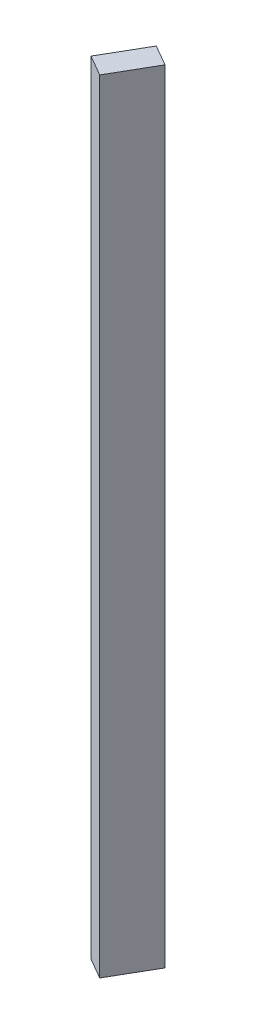
ISO-10303-21;
HEADER;
FILE_DESCRIPTION(('STEP AP214'),'2;1');
FILE_NAME('part.step','',(''),(''),'','','');
FILE_SCHEMA(('AUTOMOTIVE_DESIGN { 1 0 10303 214 1 1 1 1 }'));
ENDSEC;
DATA;
#1=APPLICATION_CONTEXT('core data for automotive mechanical design processes');
#2=APPLICATION_PROTOCOL_DEFINITION('international standard','automotive_design',2000,#1);
#3=PRODUCT_CONTEXT('',#1,'mechanical');
#4=PRODUCT('Part','Part','',(#3));
#5=PRODUCT_RELATED_PRODUCT_CATEGORY('part','',(#4));
#6=PRODUCT_DEFINITION_FORMATION('','',#4);
#7=PRODUCT_DEFINITION_CONTEXT('part definition',#1,'design');
#8=PRODUCT_DEFINITION('design','',#6,#7);
#9=PRODUCT_DEFINITION_SHAPE('','',#8);
#10=(LENGTH_UNIT() NAMED_UNIT(*) SI_UNIT(.MILLI.,.METRE.));
#11=(NAMED_UNIT(*) PLANE_ANGLE_UNIT() SI_UNIT($,.RADIAN.));
#12=(NAMED_UNIT(*) SI_UNIT($,.STERADIAN.) SOLID_ANGLE_UNIT());
#13=UNCERTAINTY_MEASURE_WITH_UNIT(LENGTH_MEASURE(1.E-05),#10,'distance_accuracy_value','');
#14=(GEOMETRIC_REPRESENTATION_CONTEXT(3) GLOBAL_UNCERTAINTY_ASSIGNED_CONTEXT((#13)) GLOBAL_UNIT_ASSIGNED_CONTEXT((#10,
#11,#12)) REPRESENTATION_CONTEXT('',''));
#15=CARTESIAN_POINT('',(0.,0.,0.));
#16=DIRECTION('',(0.,0.,1.));
#17=DIRECTION('',(1.,0.,0.));
#18=AXIS2_PLACEMENT_3D('',#15,#16,#17);
#19=CARTESIAN_POINT('',(84.8704895708749,-360.,11.));
#20=DIRECTION('',(0.5,0.,-0.866025403784439));
#21=DIRECTION('',(0.,-1.,0.));
#22=AXIS2_PLACEMENT_3D('',#19,#20,#21);
#23=PLANE('',#22);
#24=DIRECTION('',(0.866025403784439,0.,0.5));
#25=VECTOR('',#24,1.);
#26=CARTESIAN_POINT('',(65.8179306876172,-360.,0.));
#27=LINE('',#26,#25);
#28=CARTESIAN_POINT('',(65.8179306876172,-360.,0.));
#29=VERTEX_POINT('',#28);
#30=CARTESIAN_POINT('',(84.8704895708749,-360.,11.));
#31=VERTEX_POINT('',#30);
#32=EDGE_CURVE('E38',#29,#31,#27,.T.);
#33=ORIENTED_EDGE('',*,*,#32,.F.);
#34=DIRECTION('',(0.,1.,0.));
#35=VECTOR('',#34,1.);
#36=CARTESIAN_POINT('',(65.8179306876172,-360.,0.));
#37=LINE('',#36,#35);
#38=CARTESIAN_POINT('',(65.8179306876172,360.,0.));
#39=VERTEX_POINT('',#38);
#40=EDGE_CURVE('E11',#29,#39,#37,.T.);
#41=ORIENTED_EDGE('',*,*,#40,.T.);
#42=DIRECTION('',(-0.866025403784439,0.,-0.5));
#43=VECTOR('',#42,1.);
#44=CARTESIAN_POINT('',(65.8179306876172,360.,0.));
#45=LINE('',#44,#43);
#46=CARTESIAN_POINT('',(84.8704895708749,360.,11.));
#47=VERTEX_POINT('',#46);
#48=EDGE_CURVE('E99',#47,#39,#45,.T.);
#49=ORIENTED_EDGE('',*,*,#48,.F.);
#50=DIRECTION('',(0.,1.,0.));
#51=VECTOR('',#50,1.);
#52=CARTESIAN_POINT('',(84.8704895708749,-360.,11.));
#53=LINE('',#52,#51);
#54=EDGE_CURVE('E95',#31,#47,#53,.T.);
#55=ORIENTED_EDGE('',*,*,#54,.F.);
#56=EDGE_LOOP('',(#33,#41,#49,#55));
#57=FACE_BOUND('',#56,.T.);
#58=ADVANCED_FACE('F16',(#57),#23,.T.);
#59=CARTESIAN_POINT('',(61.1683571681605,-360.,30.0532975692262));
#60=DIRECTION('',(0.,-1.,0.));
#61=DIRECTION('',(0.,0.,-1.));
#62=AXIS2_PLACEMENT_3D('',#59,#60,#61);
#63=PLANE('',#62);
#64=DIRECTION('',(-0.866025403784439,0.,-0.5));
#65=VECTOR('',#64,1.);
#66=CARTESIAN_POINT('',(62.8696366097894,-360.,49.1065951384524));
#67=LINE('',#66,#65);
#68=CARTESIAN_POINT('',(62.8696366097894,-360.,49.1065951384524));
#69=VERTEX_POINT('',#68);
#70=CARTESIAN_POINT('',(43.8170777265317,-360.,38.1065951384524));
#71=VERTEX_POINT('',#70);
#72=EDGE_CURVE('E26',#69,#71,#67,.T.);
#73=ORIENTED_EDGE('',*,*,#72,.T.);
#74=DIRECTION('',(0.5,0.,-0.866025403784439));
#75=VECTOR('',#74,1.);
#76=CARTESIAN_POINT('',(43.8170777265317,-360.,38.1065951384524));
#77=LINE('',#76,#75);
#78=EDGE_CURVE('E66',#71,#29,#77,.T.);
#79=ORIENTED_EDGE('',*,*,#78,.T.);
#80=ORIENTED_EDGE('',*,*,#32,.T.);
#81=DIRECTION('',(-0.5,0.,0.866025403784439));
#82=VECTOR('',#81,1.);
#83=CARTESIAN_POINT('',(84.8704895708749,-360.,11.));
#84=LINE('',#83,#82);
#85=EDGE_CURVE('E79',#31,#69,#84,.T.);
#86=ORIENTED_EDGE('',*,*,#85,.T.);
#87=EDGE_LOOP('',(#73,#79,#80,#86));
#88=FACE_BOUND('',#87,.T.);
#89=ADVANCED_FACE('F77',(#88),#63,.T.);
#90=CARTESIAN_POINT('',(59.4670777265314,0.,11.));
#91=DIRECTION('',(-0.866025403784439,0.,-0.5));
#92=DIRECTION('',(-0.5,0.,0.866025403784439));
#93=AXIS2_PLACEMENT_3D('',#90,#91,#92);
#94=PLANE('',#93);
#95=DIRECTION('',(0.,-1.,0.));
#96=VECTOR('',#95,1.);
#97=CARTESIAN_POINT('',(43.8170777265317,0.,38.1065951384524));
#98=LINE('',#97,#96);
#99=CARTESIAN_POINT('',(43.8170777265317,360.,38.1065951384524));
#100=VERTEX_POINT('',#99);
#101=EDGE_CURVE('E71',#100,#71,#98,.T.);
#102=ORIENTED_EDGE('',*,*,#101,.F.);
#103=DIRECTION('',(-0.5,0.,0.866025403784439));
#104=VECTOR('',#103,1.);
#105=CARTESIAN_POINT('',(59.4670777265314,360.,11.));
#106=LINE('',#105,#104);
#107=EDGE_CURVE('E101',#39,#100,#106,.T.);
#108=ORIENTED_EDGE('',*,*,#107,.F.);
#109=ORIENTED_EDGE('',*,*,#40,.F.);
#110=ORIENTED_EDGE('',*,*,#78,.F.);
#111=EDGE_LOOP('',(#102,#108,#109,#110));
#112=FACE_BOUND('',#111,.T.);
#113=ADVANCED_FACE('F68',(#112),#94,.T.);
#114=CARTESIAN_POINT('',(62.8696366097894,0.,49.1065951384524));
#115=DIRECTION('',(0.86602540378444,0.,0.5));
#116=DIRECTION('',(0.,-1.,0.));
#117=AXIS2_PLACEMENT_3D('',#114,#115,#116);
#118=PLANE('',#117);
#119=DIRECTION('',(0.5,0.,-0.86602540378444));
#120=VECTOR('',#119,1.);
#121=CARTESIAN_POINT('',(78.5196366097894,360.,21.9999999999994));
#122=LINE('',#121,#120);
#123=CARTESIAN_POINT('',(62.8696366097894,360.,49.1065951384524));
#124=VERTEX_POINT('',#123);
#125=EDGE_CURVE('E96',#124,#47,#122,.T.);
#126=ORIENTED_EDGE('',*,*,#125,.F.);
#127=DIRECTION('',(0.,1.,0.));
#128=VECTOR('',#127,1.);
#129=CARTESIAN_POINT('',(62.8696366097894,0.,49.1065951384524));
#130=LINE('',#129,#128);
#131=EDGE_CURVE('E88',#69,#124,#130,.T.);
#132=ORIENTED_EDGE('',*,*,#131,.F.);
#133=ORIENTED_EDGE('',*,*,#85,.F.);
#134=ORIENTED_EDGE('',*,*,#54,.T.);
#135=EDGE_LOOP('',(#126,#132,#133,#134));
#136=FACE_BOUND('',#135,.T.);
#137=ADVANCED_FACE('F122',(#136),#118,.T.);
#138=CARTESIAN_POINT('',(43.8170777265317,0.,38.1065951384524));
#139=DIRECTION('',(-0.5,0.,0.866025403784439));
#140=DIRECTION('',(0.,1.,0.));
#141=AXIS2_PLACEMENT_3D('',#138,#139,#140);
#142=PLANE('',#141);
#143=ORIENTED_EDGE('',*,*,#131,.T.);
#144=DIRECTION('',(0.866025403784439,0.,0.5));
#145=VECTOR('',#144,1.);
#146=CARTESIAN_POINT('',(62.8696366097894,360.,49.1065951384524));
#147=LINE('',#146,#145);
#148=EDGE_CURVE('E19',#100,#124,#147,.T.);
#149=ORIENTED_EDGE('',*,*,#148,.F.);
#150=ORIENTED_EDGE('',*,*,#101,.T.);
#151=ORIENTED_EDGE('',*,*,#72,.F.);
#152=EDGE_LOOP('',(#143,#149,#150,#151));
#153=FACE_BOUND('',#152,.T.);
#154=ADVANCED_FACE('F85',(#153),#142,.T.);
#155=CARTESIAN_POINT('',(61.1683571681605,360.,30.0532975692262));
#156=DIRECTION('',(0.,1.,0.));
#157=DIRECTION('',(1.,0.,0.));
#158=AXIS2_PLACEMENT_3D('',#155,#156,#157);
#159=PLANE('',#158);
#160=ORIENTED_EDGE('',*,*,#148,.T.);
#161=ORIENTED_EDGE('',*,*,#125,.T.);
#162=ORIENTED_EDGE('',*,*,#48,.T.);
#163=ORIENTED_EDGE('',*,*,#107,.T.);
#164=EDGE_LOOP('',(#160,#161,#162,#163));
#165=FACE_BOUND('',#164,.T.);
#166=ADVANCED_FACE('F109',(#165),#159,.T.);
#167=CLOSED_SHELL('',(#58,#89,#113,#137,#154,#166));
#168=MANIFOLD_SOLID_BREP('B1',#167);
#169=ADVANCED_BREP_SHAPE_REPRESENTATION('',(#18,#168),#14);
#170=SHAPE_DEFINITION_REPRESENTATION(#9,#169);
ENDSEC;
END-ISO-10303-21;
